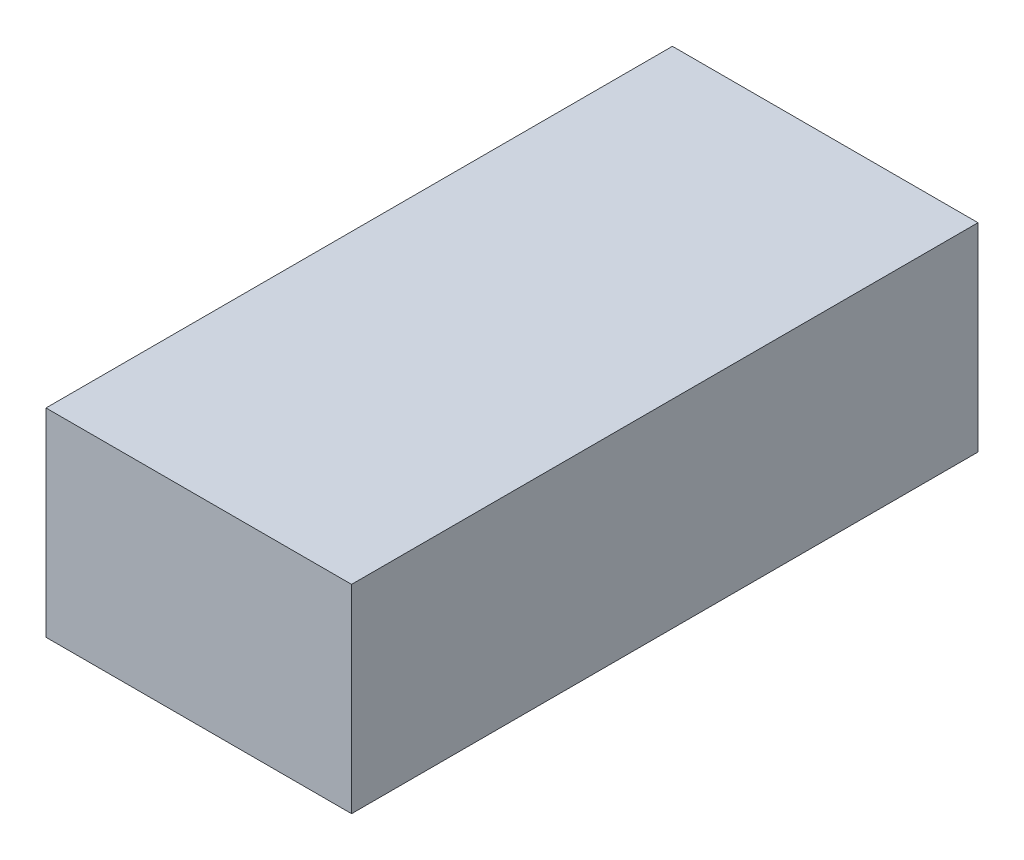
ISO-10303-21;
HEADER;
FILE_DESCRIPTION(('STEP AP214'),'2;1');
FILE_NAME('part.step','',(''),(''),'','','');
FILE_SCHEMA(('AUTOMOTIVE_DESIGN { 1 0 10303 214 1 1 1 1 }'));
ENDSEC;
DATA;
#1=APPLICATION_CONTEXT('core data for automotive mechanical design processes');
#2=APPLICATION_PROTOCOL_DEFINITION('international standard','automotive_design',2000,#1);
#3=PRODUCT_CONTEXT('',#1,'mechanical');
#4=PRODUCT('Part','Part','',(#3));
#5=PRODUCT_RELATED_PRODUCT_CATEGORY('part','',(#4));
#6=PRODUCT_DEFINITION_FORMATION('','',#4);
#7=PRODUCT_DEFINITION_CONTEXT('part definition',#1,'design');
#8=PRODUCT_DEFINITION('design','',#6,#7);
#9=PRODUCT_DEFINITION_SHAPE('','',#8);
#10=(LENGTH_UNIT() NAMED_UNIT(*) SI_UNIT(.MILLI.,.METRE.));
#11=(NAMED_UNIT(*) PLANE_ANGLE_UNIT() SI_UNIT($,.RADIAN.));
#12=(NAMED_UNIT(*) SI_UNIT($,.STERADIAN.) SOLID_ANGLE_UNIT());
#13=UNCERTAINTY_MEASURE_WITH_UNIT(LENGTH_MEASURE(1.E-05),#10,'distance_accuracy_value','');
#14=(GEOMETRIC_REPRESENTATION_CONTEXT(3) GLOBAL_UNCERTAINTY_ASSIGNED_CONTEXT((#13)) GLOBAL_UNIT_ASSIGNED_CONTEXT((#10,
#11,#12)) REPRESENTATION_CONTEXT('',''));
#15=CARTESIAN_POINT('',(0.,0.,0.));
#16=DIRECTION('',(0.,0.,1.));
#17=DIRECTION('',(1.,0.,0.));
#18=AXIS2_PLACEMENT_3D('',#15,#16,#17);
#19=CARTESIAN_POINT('',(10.,13.,-20.5));
#20=DIRECTION('',(-1.,0.,0.));
#21=DIRECTION('',(0.,0.,1.));
#22=AXIS2_PLACEMENT_3D('',#19,#20,#21);
#23=PLANE('',#22);
#24=DIRECTION('',(0.,0.,-1.));
#25=VECTOR('',#24,1.);
#26=CARTESIAN_POINT('',(10.,0.,-20.5));
#27=LINE('',#26,#25);
#28=CARTESIAN_POINT('',(10.,0.,20.5));
#29=VERTEX_POINT('',#28);
#30=CARTESIAN_POINT('',(10.,0.,-20.5));
#31=VERTEX_POINT('',#30);
#32=EDGE_CURVE('E102',#29,#31,#27,.T.);
#33=ORIENTED_EDGE('',*,*,#32,.T.);
#34=DIRECTION('',(0.,-1.,0.));
#35=VECTOR('',#34,1.);
#36=CARTESIAN_POINT('',(10.,13.,-20.5));
#37=LINE('',#36,#35);
#38=CARTESIAN_POINT('',(10.,13.,-20.5));
#39=VERTEX_POINT('',#38);
#40=EDGE_CURVE('E11',#39,#31,#37,.T.);
#41=ORIENTED_EDGE('',*,*,#40,.F.);
#42=DIRECTION('',(0.,0.,-1.));
#43=VECTOR('',#42,1.);
#44=CARTESIAN_POINT('',(10.,13.,-20.5));
#45=LINE('',#44,#43);
#46=CARTESIAN_POINT('',(10.,13.,20.5));
#47=VERTEX_POINT('',#46);
#48=EDGE_CURVE('E90',#47,#39,#45,.T.);
#49=ORIENTED_EDGE('',*,*,#48,.F.);
#50=DIRECTION('',(0.,-1.,0.));
#51=VECTOR('',#50,1.);
#52=CARTESIAN_POINT('',(10.,13.,20.5));
#53=LINE('',#52,#51);
#54=EDGE_CURVE('E98',#47,#29,#53,.T.);
#55=ORIENTED_EDGE('',*,*,#54,.T.);
#56=EDGE_LOOP('',(#33,#41,#49,#55));
#57=FACE_BOUND('',#56,.T.);
#58=ADVANCED_FACE('F39',(#57),#23,.F.);
#59=CARTESIAN_POINT('',(-10.,13.,-20.5));
#60=DIRECTION('',(0.,0.,1.));
#61=DIRECTION('',(1.,0.,0.));
#62=AXIS2_PLACEMENT_3D('',#59,#60,#61);
#63=PLANE('',#62);
#64=DIRECTION('',(-1.,0.,0.));
#65=VECTOR('',#64,1.);
#66=CARTESIAN_POINT('',(-10.,0.,-20.5));
#67=LINE('',#66,#65);
#68=CARTESIAN_POINT('',(-10.,0.,-20.5));
#69=VERTEX_POINT('',#68);
#70=EDGE_CURVE('E94',#31,#69,#67,.T.);
#71=ORIENTED_EDGE('',*,*,#70,.T.);
#72=DIRECTION('',(0.,-1.,0.));
#73=VECTOR('',#72,1.);
#74=CARTESIAN_POINT('',(-10.,13.,-20.5));
#75=LINE('',#74,#73);
#76=CARTESIAN_POINT('',(-10.,13.,-20.5));
#77=VERTEX_POINT('',#76);
#78=EDGE_CURVE('E47',#77,#69,#75,.T.);
#79=ORIENTED_EDGE('',*,*,#78,.F.);
#80=DIRECTION('',(-1.,0.,0.));
#81=VECTOR('',#80,1.);
#82=CARTESIAN_POINT('',(-10.,13.,-20.5));
#83=LINE('',#82,#81);
#84=EDGE_CURVE('E85',#39,#77,#83,.T.);
#85=ORIENTED_EDGE('',*,*,#84,.F.);
#86=ORIENTED_EDGE('',*,*,#40,.T.);
#87=EDGE_LOOP('',(#71,#79,#85,#86));
#88=FACE_BOUND('',#87,.T.);
#89=ADVANCED_FACE('F93',(#88),#63,.F.);
#90=CARTESIAN_POINT('',(-10.,13.,-20.5));
#91=DIRECTION('',(1.,0.,0.));
#92=DIRECTION('',(0.,0.,-1.));
#93=AXIS2_PLACEMENT_3D('',#90,#91,#92);
#94=PLANE('',#93);
#95=DIRECTION('',(0.,0.,1.));
#96=VECTOR('',#95,1.);
#97=CARTESIAN_POINT('',(-10.,0.,-20.5));
#98=LINE('',#97,#96);
#99=CARTESIAN_POINT('',(-10.,0.,20.5));
#100=VERTEX_POINT('',#99);
#101=EDGE_CURVE('E72',#69,#100,#98,.T.);
#102=ORIENTED_EDGE('',*,*,#101,.T.);
#103=DIRECTION('',(0.,-1.,0.));
#104=VECTOR('',#103,1.);
#105=CARTESIAN_POINT('',(-10.,13.,20.5));
#106=LINE('',#105,#104);
#107=CARTESIAN_POINT('',(-10.,13.,20.5));
#108=VERTEX_POINT('',#107);
#109=EDGE_CURVE('E95',#108,#100,#106,.T.);
#110=ORIENTED_EDGE('',*,*,#109,.F.);
#111=DIRECTION('',(0.,0.,1.));
#112=VECTOR('',#111,1.);
#113=CARTESIAN_POINT('',(-10.,13.,-20.5));
#114=LINE('',#113,#112);
#115=EDGE_CURVE('E88',#77,#108,#114,.T.);
#116=ORIENTED_EDGE('',*,*,#115,.F.);
#117=ORIENTED_EDGE('',*,*,#78,.T.);
#118=EDGE_LOOP('',(#102,#110,#116,#117));
#119=FACE_BOUND('',#118,.T.);
#120=ADVANCED_FACE('F96',(#119),#94,.F.);
#121=CARTESIAN_POINT('',(-10.,13.,20.5));
#122=DIRECTION('',(0.,0.,-1.));
#123=DIRECTION('',(-1.,0.,0.));
#124=AXIS2_PLACEMENT_3D('',#121,#122,#123);
#125=PLANE('',#124);
#126=DIRECTION('',(1.,0.,0.));
#127=VECTOR('',#126,1.);
#128=CARTESIAN_POINT('',(-10.,0.,20.5));
#129=LINE('',#128,#127);
#130=EDGE_CURVE('E78',#100,#29,#129,.T.);
#131=ORIENTED_EDGE('',*,*,#130,.T.);
#132=ORIENTED_EDGE('',*,*,#54,.F.);
#133=DIRECTION('',(1.,0.,0.));
#134=VECTOR('',#133,1.);
#135=CARTESIAN_POINT('',(-10.,13.,20.5));
#136=LINE('',#135,#134);
#137=EDGE_CURVE('E55',#108,#47,#136,.T.);
#138=ORIENTED_EDGE('',*,*,#137,.F.);
#139=ORIENTED_EDGE('',*,*,#109,.T.);
#140=EDGE_LOOP('',(#131,#132,#138,#139));
#141=FACE_BOUND('',#140,.T.);
#142=ADVANCED_FACE('F109',(#141),#125,.F.);
#143=CARTESIAN_POINT('',(0.,13.,0.));
#144=DIRECTION('',(0.,1.,0.));
#145=DIRECTION('',(0.,0.,1.));
#146=AXIS2_PLACEMENT_3D('',#143,#144,#145);
#147=PLANE('',#146);
#148=ORIENTED_EDGE('',*,*,#48,.T.);
#149=ORIENTED_EDGE('',*,*,#84,.T.);
#150=ORIENTED_EDGE('',*,*,#115,.T.);
#151=ORIENTED_EDGE('',*,*,#137,.T.);
#152=EDGE_LOOP('',(#148,#149,#150,#151));
#153=FACE_BOUND('',#152,.T.);
#154=ADVANCED_FACE('F86',(#153),#147,.T.);
#155=CARTESIAN_POINT('',(0.,0.,0.));
#156=DIRECTION('',(0.,1.,0.));
#157=DIRECTION('',(0.,0.,1.));
#158=AXIS2_PLACEMENT_3D('',#155,#156,#157);
#159=PLANE('',#158);
#160=ORIENTED_EDGE('',*,*,#32,.F.);
#161=ORIENTED_EDGE('',*,*,#130,.F.);
#162=ORIENTED_EDGE('',*,*,#101,.F.);
#163=ORIENTED_EDGE('',*,*,#70,.F.);
#164=EDGE_LOOP('',(#160,#161,#162,#163));
#165=FACE_BOUND('',#164,.T.);
#166=ADVANCED_FACE('F112',(#165),#159,.F.);
#167=CLOSED_SHELL('',(#58,#89,#120,#142,#154,#166));
#168=MANIFOLD_SOLID_BREP('B2',#167);
#169=ADVANCED_BREP_SHAPE_REPRESENTATION('',(#18,#168),#14);
#170=SHAPE_DEFINITION_REPRESENTATION(#9,#169);
ENDSEC;
END-ISO-10303-21;
